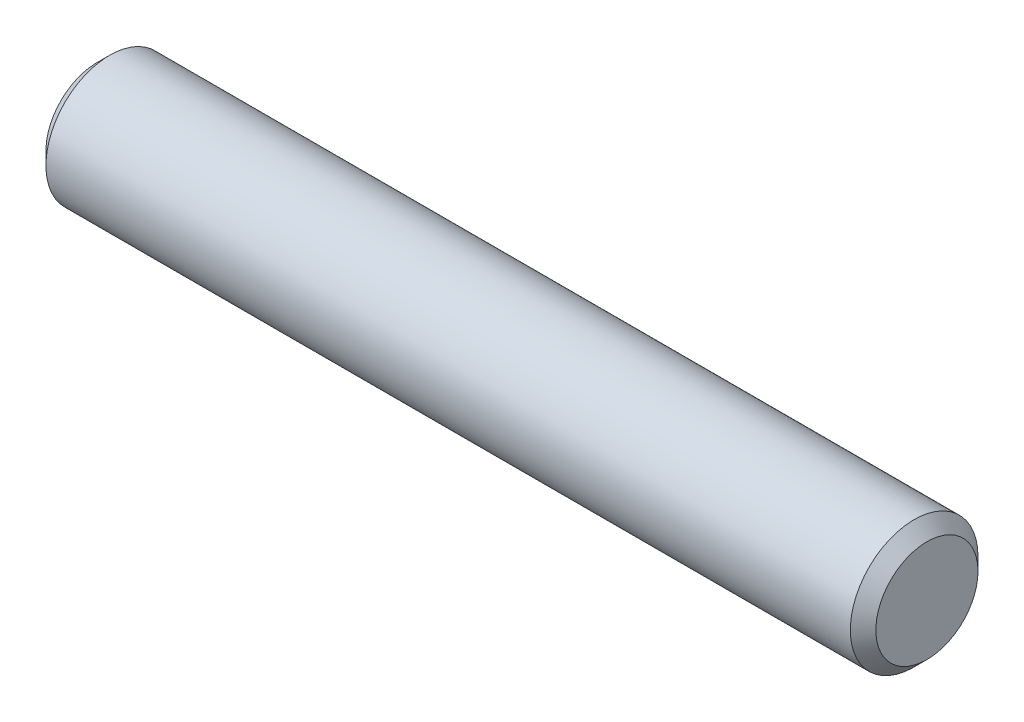
ISO-10303-21;
HEADER;
FILE_DESCRIPTION(('STEP AP214'),'2;1');
FILE_NAME('part.step','',(''),(''),'','','');
FILE_SCHEMA(('AUTOMOTIVE_DESIGN { 1 0 10303 214 1 1 1 1 }'));
ENDSEC;
DATA;
#1=APPLICATION_CONTEXT('core data for automotive mechanical design processes');
#2=APPLICATION_PROTOCOL_DEFINITION('international standard','automotive_design',2000,#1);
#3=PRODUCT_CONTEXT('',#1,'mechanical');
#4=PRODUCT('Part','Part','',(#3));
#5=PRODUCT_RELATED_PRODUCT_CATEGORY('part','',(#4));
#6=PRODUCT_DEFINITION_FORMATION('','',#4);
#7=PRODUCT_DEFINITION_CONTEXT('part definition',#1,'design');
#8=PRODUCT_DEFINITION('design','',#6,#7);
#9=PRODUCT_DEFINITION_SHAPE('','',#8);
#10=(LENGTH_UNIT() NAMED_UNIT(*) SI_UNIT(.MILLI.,.METRE.));
#11=(NAMED_UNIT(*) PLANE_ANGLE_UNIT() SI_UNIT($,.RADIAN.));
#12=(NAMED_UNIT(*) SI_UNIT($,.STERADIAN.) SOLID_ANGLE_UNIT());
#13=UNCERTAINTY_MEASURE_WITH_UNIT(LENGTH_MEASURE(1.E-05),#10,'distance_accuracy_value','');
#14=(GEOMETRIC_REPRESENTATION_CONTEXT(3) GLOBAL_UNCERTAINTY_ASSIGNED_CONTEXT((#13)) GLOBAL_UNIT_ASSIGNED_CONTEXT((#10,
#11,#12)) REPRESENTATION_CONTEXT('',''));
#15=CARTESIAN_POINT('',(0.,0.,0.));
#16=DIRECTION('',(0.,0.,1.));
#17=DIRECTION('',(1.,0.,0.));
#18=AXIS2_PLACEMENT_3D('',#15,#16,#17);
#19=CARTESIAN_POINT('',(9.75,0.,0.));
#20=DIRECTION('',(-1.,0.,0.));
#21=DIRECTION('',(0.,0.,1.));
#22=AXIS2_PLACEMENT_3D('',#19,#20,#21);
#23=CYLINDRICAL_SURFACE('',#22,1.5);
#24=CARTESIAN_POINT('',(-9.45,0.,0.));
#25=DIRECTION('',(1.,0.,0.));
#26=DIRECTION('',(0.,0.,-1.));
#27=AXIS2_PLACEMENT_3D('',#24,#25,#26);
#28=CIRCLE('',#27,1.5);
#29=CARTESIAN_POINT('',(-9.45,0.,-1.5));
#30=VERTEX_POINT('',#29);
#31=EDGE_CURVE('E41',#30,#30,#28,.T.);
#32=ORIENTED_EDGE('',*,*,#31,.T.);
#33=EDGE_LOOP('',(#32));
#34=FACE_BOUND('',#33,.T.);
#35=CARTESIAN_POINT('',(9.44999999999999,0.,0.));
#36=DIRECTION('',(1.,0.,0.));
#37=DIRECTION('',(0.,0.,-1.));
#38=AXIS2_PLACEMENT_3D('',#35,#36,#37);
#39=CIRCLE('',#38,1.5);
#40=CARTESIAN_POINT('',(9.44999999999999,0.,-1.5));
#41=VERTEX_POINT('',#40);
#42=EDGE_CURVE('E45',#41,#41,#39,.F.);
#43=ORIENTED_EDGE('',*,*,#42,.T.);
#44=EDGE_LOOP('',(#43));
#45=FACE_BOUND('',#44,.T.);
#46=ADVANCED_FACE('F30',(#34,#45),#23,.T.);
#47=CARTESIAN_POINT('',(9.75,0.,0.));
#48=DIRECTION('',(1.,0.,0.));
#49=DIRECTION('',(0.,0.,-1.));
#50=AXIS2_PLACEMENT_3D('',#47,#48,#49);
#51=PLANE('',#50);
#52=CARTESIAN_POINT('',(9.75,0.,0.));
#53=DIRECTION('',(1.,0.,0.));
#54=DIRECTION('',(0.,0.,-1.));
#55=AXIS2_PLACEMENT_3D('',#52,#53,#54);
#56=CIRCLE('',#55,1.19999999999999);
#57=CARTESIAN_POINT('',(9.75,0.,-1.19999999999999));
#58=VERTEX_POINT('',#57);
#59=EDGE_CURVE('E10',#58,#58,#56,.T.);
#60=ORIENTED_EDGE('',*,*,#59,.T.);
#61=EDGE_LOOP('',(#60));
#62=FACE_BOUND('',#61,.T.);
#63=ADVANCED_FACE('F61',(#62),#51,.T.);
#64=CARTESIAN_POINT('',(-9.75,0.,0.));
#65=DIRECTION('',(1.,0.,0.));
#66=DIRECTION('',(0.,0.,-1.));
#67=AXIS2_PLACEMENT_3D('',#64,#65,#66);
#68=PLANE('',#67);
#69=CARTESIAN_POINT('',(-9.75,0.,0.));
#70=DIRECTION('',(1.,0.,0.));
#71=DIRECTION('',(0.,0.,-1.));
#72=AXIS2_PLACEMENT_3D('',#69,#70,#71);
#73=CIRCLE('',#72,1.2);
#74=CARTESIAN_POINT('',(-9.75,0.,-1.2));
#75=VERTEX_POINT('',#74);
#76=EDGE_CURVE('E37',#75,#75,#73,.F.);
#77=ORIENTED_EDGE('',*,*,#76,.T.);
#78=EDGE_LOOP('',(#77));
#79=FACE_BOUND('',#78,.T.);
#80=ADVANCED_FACE('F58',(#79),#68,.F.);
#81=CARTESIAN_POINT('',(-9.45,0.,0.));
#82=DIRECTION('',(1.,0.,0.));
#83=DIRECTION('',(0.,0.,-1.));
#84=AXIS2_PLACEMENT_3D('',#81,#82,#83);
#85=CONICAL_SURFACE('',#84,1.5,0.785398163397457);
#86=ORIENTED_EDGE('',*,*,#76,.F.);
#87=EDGE_LOOP('',(#86));
#88=FACE_BOUND('',#87,.T.);
#89=ORIENTED_EDGE('',*,*,#31,.F.);
#90=EDGE_LOOP('',(#89));
#91=FACE_BOUND('',#90,.T.);
#92=ADVANCED_FACE('F54',(#88,#91),#85,.T.);
#93=CARTESIAN_POINT('',(9.75,0.,0.));
#94=DIRECTION('',(-1.,0.,0.));
#95=DIRECTION('',(0.,0.,1.));
#96=AXIS2_PLACEMENT_3D('',#93,#94,#95);
#97=CONICAL_SURFACE('',#96,1.19999999999999,0.785398163397446);
#98=ORIENTED_EDGE('',*,*,#42,.F.);
#99=EDGE_LOOP('',(#98));
#100=FACE_BOUND('',#99,.T.);
#101=ORIENTED_EDGE('',*,*,#59,.F.);
#102=EDGE_LOOP('',(#101));
#103=FACE_BOUND('',#102,.T.);
#104=ADVANCED_FACE('F32',(#100,#103),#97,.T.);
#105=CLOSED_SHELL('',(#46,#63,#80,#92,#104));
#106=MANIFOLD_SOLID_BREP('B2',#105);
#107=ADVANCED_BREP_SHAPE_REPRESENTATION('',(#18,#106),#14);
#108=SHAPE_DEFINITION_REPRESENTATION(#9,#107);
ENDSEC;
END-ISO-10303-21;
